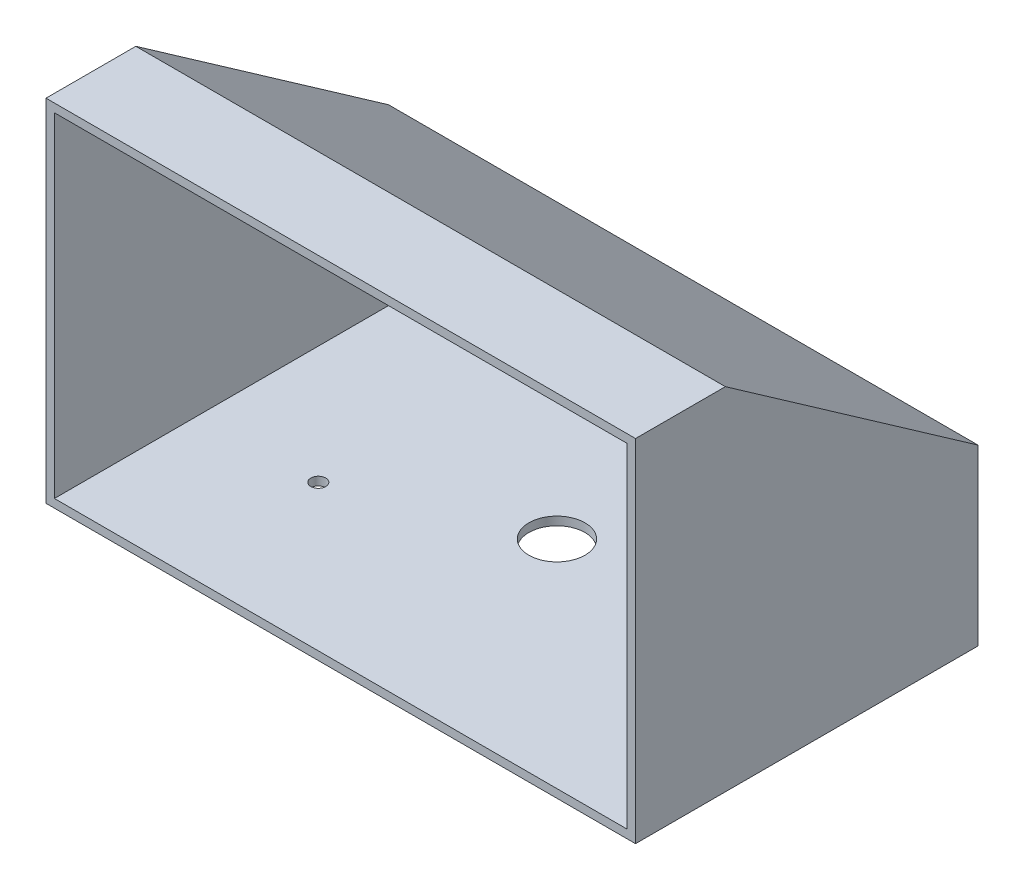
ISO-10303-21;
HEADER;
FILE_DESCRIPTION(('STEP AP214'),'2;1');
FILE_NAME('part.step','',(''),(''),'','','');
FILE_SCHEMA(('AUTOMOTIVE_DESIGN { 1 0 10303 214 1 1 1 1 }'));
ENDSEC;
DATA;
#1=APPLICATION_CONTEXT('core data for automotive mechanical design processes');
#2=APPLICATION_PROTOCOL_DEFINITION('international standard','automotive_design',2000,#1);
#3=PRODUCT_CONTEXT('',#1,'mechanical');
#4=PRODUCT('Part','Part','',(#3));
#5=PRODUCT_RELATED_PRODUCT_CATEGORY('part','',(#4));
#6=PRODUCT_DEFINITION_FORMATION('','',#4);
#7=PRODUCT_DEFINITION_CONTEXT('part definition',#1,'design');
#8=PRODUCT_DEFINITION('design','',#6,#7);
#9=PRODUCT_DEFINITION_SHAPE('','',#8);
#10=(LENGTH_UNIT() NAMED_UNIT(*) SI_UNIT(.MILLI.,.METRE.));
#11=(NAMED_UNIT(*) PLANE_ANGLE_UNIT() SI_UNIT($,.RADIAN.));
#12=(NAMED_UNIT(*) SI_UNIT($,.STERADIAN.) SOLID_ANGLE_UNIT());
#13=UNCERTAINTY_MEASURE_WITH_UNIT(LENGTH_MEASURE(1.E-05),#10,'distance_accuracy_value','');
#14=(GEOMETRIC_REPRESENTATION_CONTEXT(3) GLOBAL_UNCERTAINTY_ASSIGNED_CONTEXT((#13)) GLOBAL_UNIT_ASSIGNED_CONTEXT((#10,
#11,#12)) REPRESENTATION_CONTEXT('',''));
#15=CARTESIAN_POINT('',(0.,0.,0.));
#16=DIRECTION('',(0.,0.,1.));
#17=DIRECTION('',(1.,0.,0.));
#18=AXIS2_PLACEMENT_3D('',#15,#16,#17);
#19=CARTESIAN_POINT('',(105.,0.,52.));
#20=DIRECTION('',(0.,0.,-1.));
#21=DIRECTION('',(-1.,0.,0.));
#22=AXIS2_PLACEMENT_3D('',#19,#20,#21);
#23=PLANE('',#22);
#24=DIRECTION('',(0.,-1.,0.));
#25=VECTOR('',#24,1.);
#26=CARTESIAN_POINT('',(-105.,0.,52.));
#27=LINE('',#26,#25);
#28=CARTESIAN_POINT('',(-105.,125.,52.));
#29=VERTEX_POINT('',#28);
#30=CARTESIAN_POINT('',(-105.,0.,52.));
#31=VERTEX_POINT('',#30);
#32=EDGE_CURVE('E133',#29,#31,#27,.T.);
#33=ORIENTED_EDGE('',*,*,#32,.T.);
#34=DIRECTION('',(-1.,0.,0.));
#35=VECTOR('',#34,1.);
#36=CARTESIAN_POINT('',(105.,0.,52.));
#37=LINE('',#36,#35);
#38=CARTESIAN_POINT('',(105.,0.,52.));
#39=VERTEX_POINT('',#38);
#40=EDGE_CURVE('E118',#39,#31,#37,.T.);
#41=ORIENTED_EDGE('',*,*,#40,.F.);
#42=DIRECTION('',(0.,-1.,0.));
#43=VECTOR('',#42,1.);
#44=CARTESIAN_POINT('',(105.,0.,52.));
#45=LINE('',#44,#43);
#46=CARTESIAN_POINT('',(105.,125.,52.));
#47=VERTEX_POINT('',#46);
#48=EDGE_CURVE('E106',#47,#39,#45,.T.);
#49=ORIENTED_EDGE('',*,*,#48,.F.);
#50=DIRECTION('',(-1.,0.,0.));
#51=VECTOR('',#50,1.);
#52=CARTESIAN_POINT('',(105.,125.,52.));
#53=LINE('',#52,#51);
#54=EDGE_CURVE('E115',#47,#29,#53,.T.);
#55=ORIENTED_EDGE('',*,*,#54,.T.);
#56=EDGE_LOOP('',(#33,#41,#49,#55));
#57=FACE_BOUND('',#56,.T.);
#58=DIRECTION('',(0.,-1.,0.));
#59=VECTOR('',#58,1.);
#60=CARTESIAN_POINT('',(-102.,0.,52.));
#61=LINE('',#60,#59);
#62=CARTESIAN_POINT('',(-102.,122.,52.));
#63=VERTEX_POINT('',#62);
#64=CARTESIAN_POINT('',(-102.,3.,52.));
#65=VERTEX_POINT('',#64);
#66=EDGE_CURVE('E154',#63,#65,#61,.T.);
#67=ORIENTED_EDGE('',*,*,#66,.F.);
#68=DIRECTION('',(-1.,0.,0.));
#69=VECTOR('',#68,1.);
#70=CARTESIAN_POINT('',(105.,122.,52.));
#71=LINE('',#70,#69);
#72=CARTESIAN_POINT('',(102.,122.,52.));
#73=VERTEX_POINT('',#72);
#74=EDGE_CURVE('E153',#73,#63,#71,.T.);
#75=ORIENTED_EDGE('',*,*,#74,.F.);
#76=DIRECTION('',(0.,-1.,0.));
#77=VECTOR('',#76,1.);
#78=CARTESIAN_POINT('',(102.,0.,52.));
#79=LINE('',#78,#77);
#80=CARTESIAN_POINT('',(102.,3.,52.));
#81=VERTEX_POINT('',#80);
#82=EDGE_CURVE('E53',#73,#81,#79,.T.);
#83=ORIENTED_EDGE('',*,*,#82,.T.);
#84=DIRECTION('',(-1.,0.,0.));
#85=VECTOR('',#84,1.);
#86=CARTESIAN_POINT('',(105.,3.,52.));
#87=LINE('',#86,#85);
#88=EDGE_CURVE('E147',#81,#65,#87,.T.);
#89=ORIENTED_EDGE('',*,*,#88,.T.);
#90=EDGE_LOOP('',(#67,#75,#83,#89));
#91=FACE_BOUND('',#90,.T.);
#92=ADVANCED_FACE('F39',(#57,#91),#23,.F.);
#93=CARTESIAN_POINT('',(105.,61.9813215611261,-70.));
#94=DIRECTION('',(0.,0.,1.));
#95=DIRECTION('',(1.,0.,0.));
#96=AXIS2_PLACEMENT_3D('',#93,#94,#95);
#97=PLANE('',#96);
#98=DIRECTION('',(0.,1.,0.));
#99=VECTOR('',#98,1.);
#100=CARTESIAN_POINT('',(-105.,61.9813215611261,-70.));
#101=LINE('',#100,#99);
#102=CARTESIAN_POINT('',(-105.,0.,-70.));
#103=VERTEX_POINT('',#102);
#104=CARTESIAN_POINT('',(-105.,61.9813215611261,-70.));
#105=VERTEX_POINT('',#104);
#106=EDGE_CURVE('E127',#103,#105,#101,.T.);
#107=ORIENTED_EDGE('',*,*,#106,.T.);
#108=DIRECTION('',(-1.,0.,0.));
#109=VECTOR('',#108,1.);
#110=CARTESIAN_POINT('',(105.,61.9813215611261,-70.));
#111=LINE('',#110,#109);
#112=CARTESIAN_POINT('',(105.,61.9813215611261,-70.));
#113=VERTEX_POINT('',#112);
#114=EDGE_CURVE('E11',#113,#105,#111,.T.);
#115=ORIENTED_EDGE('',*,*,#114,.F.);
#116=DIRECTION('',(0.,1.,0.));
#117=VECTOR('',#116,1.);
#118=CARTESIAN_POINT('',(105.,61.9813215611261,-70.));
#119=LINE('',#118,#117);
#120=CARTESIAN_POINT('',(105.,0.,-70.));
#121=VERTEX_POINT('',#120);
#122=EDGE_CURVE('E139',#121,#113,#119,.T.);
#123=ORIENTED_EDGE('',*,*,#122,.F.);
#124=DIRECTION('',(-1.,0.,0.));
#125=VECTOR('',#124,1.);
#126=CARTESIAN_POINT('',(105.,0.,-70.));
#127=LINE('',#126,#125);
#128=EDGE_CURVE('E121',#121,#103,#127,.T.);
#129=ORIENTED_EDGE('',*,*,#128,.T.);
#130=EDGE_LOOP('',(#107,#115,#123,#129));
#131=FACE_BOUND('',#130,.T.);
#132=ADVANCED_FACE('F41',(#131),#97,.F.);
#133=CARTESIAN_POINT('',(105.,125.,20.));
#134=DIRECTION('',(0.,-0.819152044288992,0.573576436351046));
#135=DIRECTION('',(0.,-0.573576436351046,-0.819152044288992));
#136=AXIS2_PLACEMENT_3D('',#133,#134,#135);
#137=PLANE('',#136);
#138=DIRECTION('',(0.,0.573576436351046,0.819152044288992));
#139=VECTOR('',#138,1.);
#140=CARTESIAN_POINT('',(-105.,125.,20.));
#141=LINE('',#140,#139);
#142=CARTESIAN_POINT('',(-105.,125.,20.));
#143=VERTEX_POINT('',#142);
#144=EDGE_CURVE('E129',#105,#143,#141,.T.);
#145=ORIENTED_EDGE('',*,*,#144,.T.);
#146=DIRECTION('',(-1.,0.,0.));
#147=VECTOR('',#146,1.);
#148=CARTESIAN_POINT('',(105.,125.,20.));
#149=LINE('',#148,#147);
#150=CARTESIAN_POINT('',(105.,125.,20.));
#151=VERTEX_POINT('',#150);
#152=EDGE_CURVE('E50',#151,#143,#149,.T.);
#153=ORIENTED_EDGE('',*,*,#152,.F.);
#154=DIRECTION('',(0.,0.573576436351046,0.819152044288992));
#155=VECTOR('',#154,1.);
#156=CARTESIAN_POINT('',(105.,125.,20.));
#157=LINE('',#156,#155);
#158=EDGE_CURVE('E92',#113,#151,#157,.T.);
#159=ORIENTED_EDGE('',*,*,#158,.F.);
#160=ORIENTED_EDGE('',*,*,#114,.T.);
#161=EDGE_LOOP('',(#145,#153,#159,#160));
#162=FACE_BOUND('',#161,.T.);
#163=ADVANCED_FACE('F275',(#162),#137,.F.);
#164=CARTESIAN_POINT('',(105.,125.,52.));
#165=DIRECTION('',(0.,-1.,0.));
#166=DIRECTION('',(0.,0.,-1.));
#167=AXIS2_PLACEMENT_3D('',#164,#165,#166);
#168=PLANE('',#167);
#169=DIRECTION('',(0.,0.,1.));
#170=VECTOR('',#169,1.);
#171=CARTESIAN_POINT('',(-105.,125.,52.));
#172=LINE('',#171,#170);
#173=EDGE_CURVE('E113',#143,#29,#172,.T.);
#174=ORIENTED_EDGE('',*,*,#173,.T.);
#175=ORIENTED_EDGE('',*,*,#54,.F.);
#176=DIRECTION('',(0.,0.,1.));
#177=VECTOR('',#176,1.);
#178=CARTESIAN_POINT('',(105.,125.,52.));
#179=LINE('',#178,#177);
#180=EDGE_CURVE('E105',#151,#47,#179,.T.);
#181=ORIENTED_EDGE('',*,*,#180,.F.);
#182=ORIENTED_EDGE('',*,*,#152,.T.);
#183=EDGE_LOOP('',(#174,#175,#181,#182));
#184=FACE_BOUND('',#183,.T.);
#185=ADVANCED_FACE('F114',(#184),#168,.F.);
#186=CARTESIAN_POINT('',(105.,0.,-70.));
#187=DIRECTION('',(0.,1.,0.));
#188=DIRECTION('',(0.,0.,1.));
#189=AXIS2_PLACEMENT_3D('',#186,#187,#188);
#190=PLANE('',#189);
#191=CARTESIAN_POINT('',(60.,0.,0.));
#192=DIRECTION('',(0.,1.,0.));
#193=DIRECTION('',(0.,0.,1.));
#194=AXIS2_PLACEMENT_3D('',#191,#192,#193);
#195=CIRCLE('',#194,2.65);
#196=CARTESIAN_POINT('',(60.,0.,2.65));
#197=VERTEX_POINT('',#196);
#198=EDGE_CURVE('E203',#197,#197,#195,.T.);
#199=ORIENTED_EDGE('',*,*,#198,.T.);
#200=EDGE_LOOP('',(#199));
#201=FACE_BOUND('',#200,.T.);
#202=CARTESIAN_POINT('',(-60.,0.,0.));
#203=DIRECTION('',(0.,1.,0.));
#204=DIRECTION('',(0.,0.,1.));
#205=AXIS2_PLACEMENT_3D('',#202,#203,#204);
#206=CIRCLE('',#205,2.65);
#207=CARTESIAN_POINT('',(-60.,0.,2.65));
#208=VERTEX_POINT('',#207);
#209=EDGE_CURVE('E196',#208,#208,#206,.T.);
#210=ORIENTED_EDGE('',*,*,#209,.T.);
#211=EDGE_LOOP('',(#210));
#212=FACE_BOUND('',#211,.T.);
#213=CARTESIAN_POINT('',(0.,0.,-25.));
#214=DIRECTION('',(0.,1.,0.));
#215=DIRECTION('',(0.,0.,1.));
#216=AXIS2_PLACEMENT_3D('',#213,#214,#215);
#217=CIRCLE('',#216,10.);
#218=CARTESIAN_POINT('',(0.,0.,-15.));
#219=VERTEX_POINT('',#218);
#220=EDGE_CURVE('E191',#219,#219,#217,.T.);
#221=ORIENTED_EDGE('',*,*,#220,.T.);
#222=EDGE_LOOP('',(#221));
#223=FACE_BOUND('',#222,.T.);
#224=DIRECTION('',(0.,0.,-1.));
#225=VECTOR('',#224,1.);
#226=CARTESIAN_POINT('',(-105.,0.,-70.));
#227=LINE('',#226,#225);
#228=EDGE_CURVE('E87',#31,#103,#227,.T.);
#229=ORIENTED_EDGE('',*,*,#228,.T.);
#230=ORIENTED_EDGE('',*,*,#128,.F.);
#231=DIRECTION('',(0.,0.,-1.));
#232=VECTOR('',#231,1.);
#233=CARTESIAN_POINT('',(105.,0.,-70.));
#234=LINE('',#233,#232);
#235=EDGE_CURVE('E63',#39,#121,#234,.T.);
#236=ORIENTED_EDGE('',*,*,#235,.F.);
#237=ORIENTED_EDGE('',*,*,#40,.T.);
#238=EDGE_LOOP('',(#229,#230,#236,#237));
#239=FACE_BOUND('',#238,.T.);
#240=ADVANCED_FACE('F143',(#201,#212,#223,#239),#190,.F.);
#241=CARTESIAN_POINT('',(105.,0.,0.));
#242=DIRECTION('',(-1.,0.,0.));
#243=DIRECTION('',(0.,0.,1.));
#244=AXIS2_PLACEMENT_3D('',#241,#242,#243);
#245=PLANE('',#244);
#246=ORIENTED_EDGE('',*,*,#122,.T.);
#247=ORIENTED_EDGE('',*,*,#158,.T.);
#248=ORIENTED_EDGE('',*,*,#180,.T.);
#249=ORIENTED_EDGE('',*,*,#48,.T.);
#250=ORIENTED_EDGE('',*,*,#235,.T.);
#251=EDGE_LOOP('',(#246,#247,#248,#249,#250));
#252=FACE_BOUND('',#251,.T.);
#253=ADVANCED_FACE('F102',(#252),#245,.F.);
#254=CARTESIAN_POINT('',(-105.,0.,0.));
#255=DIRECTION('',(-1.,0.,0.));
#256=DIRECTION('',(0.,0.,1.));
#257=AXIS2_PLACEMENT_3D('',#254,#255,#256);
#258=PLANE('',#257);
#259=ORIENTED_EDGE('',*,*,#106,.F.);
#260=ORIENTED_EDGE('',*,*,#228,.F.);
#261=ORIENTED_EDGE('',*,*,#32,.F.);
#262=ORIENTED_EDGE('',*,*,#173,.F.);
#263=ORIENTED_EDGE('',*,*,#144,.F.);
#264=EDGE_LOOP('',(#259,#260,#261,#262,#263));
#265=FACE_BOUND('',#264,.T.);
#266=ADVANCED_FACE('F137',(#265),#258,.T.);
#267=CARTESIAN_POINT('',(105.,61.9813215611261,-67.));
#268=DIRECTION('',(0.,0.,1.));
#269=DIRECTION('',(1.,0.,0.));
#270=AXIS2_PLACEMENT_3D('',#267,#268,#269);
#271=PLANE('',#270);
#272=DIRECTION('',(0.,1.,0.));
#273=VECTOR('',#272,1.);
#274=CARTESIAN_POINT('',(-102.,0.,-67.));
#275=LINE('',#274,#273);
#276=CARTESIAN_POINT('',(-102.,3.,-67.));
#277=VERTEX_POINT('',#276);
#278=CARTESIAN_POINT('',(-102.,60.4196204094709,-67.));
#279=VERTEX_POINT('',#278);
#280=EDGE_CURVE('E178',#277,#279,#275,.T.);
#281=ORIENTED_EDGE('',*,*,#280,.F.);
#282=DIRECTION('',(-1.,0.,0.));
#283=VECTOR('',#282,1.);
#284=CARTESIAN_POINT('',(105.,3.,-67.));
#285=LINE('',#284,#283);
#286=CARTESIAN_POINT('',(102.,3.,-67.));
#287=VERTEX_POINT('',#286);
#288=EDGE_CURVE('E152',#287,#277,#285,.T.);
#289=ORIENTED_EDGE('',*,*,#288,.F.);
#290=DIRECTION('',(0.,1.,0.));
#291=VECTOR('',#290,1.);
#292=CARTESIAN_POINT('',(102.,0.,-67.));
#293=LINE('',#292,#291);
#294=CARTESIAN_POINT('',(102.,60.4196204094709,-67.));
#295=VERTEX_POINT('',#294);
#296=EDGE_CURVE('E164',#287,#295,#293,.T.);
#297=ORIENTED_EDGE('',*,*,#296,.T.);
#298=DIRECTION('',(-1.,0.,0.));
#299=VECTOR('',#298,1.);
#300=CARTESIAN_POINT('',(105.,60.4196204094709,-67.));
#301=LINE('',#300,#299);
#302=EDGE_CURVE('E128',#295,#279,#301,.T.);
#303=ORIENTED_EDGE('',*,*,#302,.T.);
#304=EDGE_LOOP('',(#281,#289,#297,#303));
#305=FACE_BOUND('',#304,.T.);
#306=ADVANCED_FACE('F248',(#305),#271,.T.);
#307=CARTESIAN_POINT('',(105.,122.542543867133,21.7207293090531));
#308=DIRECTION('',(0.,-0.819152044288992,0.573576436351046));
#309=DIRECTION('',(0.,-0.573576436351046,-0.819152044288992));
#310=AXIS2_PLACEMENT_3D('',#307,#308,#309);
#311=PLANE('',#310);
#312=DIRECTION('',(0.,0.573576436351046,0.819152044288992));
#313=VECTOR('',#312,1.);
#314=CARTESIAN_POINT('',(-102.,72.0218766171283,-50.4302609233228));
#315=LINE('',#314,#313);
#316=CARTESIAN_POINT('',(-102.,122.,20.945896366637));
#317=VERTEX_POINT('',#316);
#318=EDGE_CURVE('E175',#279,#317,#315,.T.);
#319=ORIENTED_EDGE('',*,*,#318,.F.);
#320=ORIENTED_EDGE('',*,*,#302,.F.);
#321=DIRECTION('',(0.,0.573576436351046,0.819152044288992));
#322=VECTOR('',#321,1.);
#323=CARTESIAN_POINT('',(102.,72.0218766171283,-50.4302609233228));
#324=LINE('',#323,#322);
#325=CARTESIAN_POINT('',(102.,122.,20.945896366637));
#326=VERTEX_POINT('',#325);
#327=EDGE_CURVE('E166',#295,#326,#324,.T.);
#328=ORIENTED_EDGE('',*,*,#327,.T.);
#329=DIRECTION('',(-1.,0.,0.));
#330=VECTOR('',#329,1.);
#331=CARTESIAN_POINT('',(105.,122.,20.945896366637));
#332=LINE('',#331,#330);
#333=EDGE_CURVE('E165',#326,#317,#332,.T.);
#334=ORIENTED_EDGE('',*,*,#333,.T.);
#335=EDGE_LOOP('',(#319,#320,#328,#334));
#336=FACE_BOUND('',#335,.T.);
#337=ADVANCED_FACE('F246',(#336),#311,.T.);
#338=CARTESIAN_POINT('',(105.,122.,52.));
#339=DIRECTION('',(0.,-1.,0.));
#340=DIRECTION('',(0.,0.,-1.));
#341=AXIS2_PLACEMENT_3D('',#338,#339,#340);
#342=PLANE('',#341);
#343=DIRECTION('',(0.,0.,1.));
#344=VECTOR('',#343,1.);
#345=CARTESIAN_POINT('',(-102.,122.,0.));
#346=LINE('',#345,#344);
#347=EDGE_CURVE('E157',#317,#63,#346,.T.);
#348=ORIENTED_EDGE('',*,*,#347,.F.);
#349=ORIENTED_EDGE('',*,*,#333,.F.);
#350=DIRECTION('',(0.,0.,1.));
#351=VECTOR('',#350,1.);
#352=CARTESIAN_POINT('',(102.,122.,0.));
#353=LINE('',#352,#351);
#354=EDGE_CURVE('E149',#326,#73,#353,.T.);
#355=ORIENTED_EDGE('',*,*,#354,.T.);
#356=ORIENTED_EDGE('',*,*,#74,.T.);
#357=EDGE_LOOP('',(#348,#349,#355,#356));
#358=FACE_BOUND('',#357,.T.);
#359=ADVANCED_FACE('F212',(#358),#342,.T.);
#360=CARTESIAN_POINT('',(105.,3.,-70.));
#361=DIRECTION('',(0.,1.,0.));
#362=DIRECTION('',(0.,0.,1.));
#363=AXIS2_PLACEMENT_3D('',#360,#361,#362);
#364=PLANE('',#363);
#365=CARTESIAN_POINT('',(60.,3.,0.));
#366=DIRECTION('',(0.,1.,0.));
#367=DIRECTION('',(0.,0.,1.));
#368=AXIS2_PLACEMENT_3D('',#365,#366,#367);
#369=CIRCLE('',#368,2.65);
#370=CARTESIAN_POINT('',(60.,3.,2.65));
#371=VERTEX_POINT('',#370);
#372=EDGE_CURVE('E188',#371,#371,#369,.T.);
#373=ORIENTED_EDGE('',*,*,#372,.F.);
#374=EDGE_LOOP('',(#373));
#375=FACE_BOUND('',#374,.T.);
#376=CARTESIAN_POINT('',(-60.,3.,0.));
#377=DIRECTION('',(0.,1.,0.));
#378=DIRECTION('',(0.,0.,1.));
#379=AXIS2_PLACEMENT_3D('',#376,#377,#378);
#380=CIRCLE('',#379,2.65);
#381=CARTESIAN_POINT('',(-60.,3.,2.65));
#382=VERTEX_POINT('',#381);
#383=EDGE_CURVE('E192',#382,#382,#380,.T.);
#384=ORIENTED_EDGE('',*,*,#383,.F.);
#385=EDGE_LOOP('',(#384));
#386=FACE_BOUND('',#385,.T.);
#387=CARTESIAN_POINT('',(0.,3.,-25.));
#388=DIRECTION('',(0.,1.,0.));
#389=DIRECTION('',(0.,0.,1.));
#390=AXIS2_PLACEMENT_3D('',#387,#388,#389);
#391=CIRCLE('',#390,10.);
#392=CARTESIAN_POINT('',(0.,3.,-15.));
#393=VERTEX_POINT('',#392);
#394=EDGE_CURVE('E189',#393,#393,#391,.T.);
#395=ORIENTED_EDGE('',*,*,#394,.F.);
#396=EDGE_LOOP('',(#395));
#397=FACE_BOUND('',#396,.T.);
#398=DIRECTION('',(0.,0.,-1.));
#399=VECTOR('',#398,1.);
#400=CARTESIAN_POINT('',(-102.,3.,0.));
#401=LINE('',#400,#399);
#402=EDGE_CURVE('E158',#65,#277,#401,.T.);
#403=ORIENTED_EDGE('',*,*,#402,.F.);
#404=ORIENTED_EDGE('',*,*,#88,.F.);
#405=DIRECTION('',(0.,0.,-1.));
#406=VECTOR('',#405,1.);
#407=CARTESIAN_POINT('',(102.,3.,0.));
#408=LINE('',#407,#406);
#409=EDGE_CURVE('E146',#81,#287,#408,.T.);
#410=ORIENTED_EDGE('',*,*,#409,.T.);
#411=ORIENTED_EDGE('',*,*,#288,.T.);
#412=EDGE_LOOP('',(#403,#404,#410,#411));
#413=FACE_BOUND('',#412,.T.);
#414=ADVANCED_FACE('F209',(#375,#386,#397,#413),#364,.T.);
#415=CARTESIAN_POINT('',(102.,0.,0.));
#416=DIRECTION('',(-1.,0.,0.));
#417=DIRECTION('',(0.,0.,1.));
#418=AXIS2_PLACEMENT_3D('',#415,#416,#417);
#419=PLANE('',#418);
#420=ORIENTED_EDGE('',*,*,#296,.F.);
#421=ORIENTED_EDGE('',*,*,#409,.F.);
#422=ORIENTED_EDGE('',*,*,#82,.F.);
#423=ORIENTED_EDGE('',*,*,#354,.F.);
#424=ORIENTED_EDGE('',*,*,#327,.F.);
#425=EDGE_LOOP('',(#420,#421,#422,#423,#424));
#426=FACE_BOUND('',#425,.T.);
#427=ADVANCED_FACE('F213',(#426),#419,.T.);
#428=CARTESIAN_POINT('',(-102.,0.,0.));
#429=DIRECTION('',(-1.,0.,0.));
#430=DIRECTION('',(0.,0.,1.));
#431=AXIS2_PLACEMENT_3D('',#428,#429,#430);
#432=PLANE('',#431);
#433=ORIENTED_EDGE('',*,*,#280,.T.);
#434=ORIENTED_EDGE('',*,*,#318,.T.);
#435=ORIENTED_EDGE('',*,*,#347,.T.);
#436=ORIENTED_EDGE('',*,*,#66,.T.);
#437=ORIENTED_EDGE('',*,*,#402,.T.);
#438=EDGE_LOOP('',(#433,#434,#435,#436,#437));
#439=FACE_BOUND('',#438,.T.);
#440=ADVANCED_FACE('F253',(#439),#432,.F.);
#441=CARTESIAN_POINT('',(0.,3.,-25.));
#442=DIRECTION('',(0.,-1.,0.));
#443=DIRECTION('',(0.,0.,-1.));
#444=AXIS2_PLACEMENT_3D('',#441,#442,#443);
#445=CYLINDRICAL_SURFACE('',#444,10.);
#446=ORIENTED_EDGE('',*,*,#394,.T.);
#447=EDGE_LOOP('',(#446));
#448=FACE_BOUND('',#447,.T.);
#449=ORIENTED_EDGE('',*,*,#220,.F.);
#450=EDGE_LOOP('',(#449));
#451=FACE_BOUND('',#450,.T.);
#452=ADVANCED_FACE('F251',(#448,#451),#445,.F.);
#453=CARTESIAN_POINT('',(-60.,3.,0.));
#454=DIRECTION('',(0.,-1.,0.));
#455=DIRECTION('',(0.,0.,-1.));
#456=AXIS2_PLACEMENT_3D('',#453,#454,#455);
#457=CYLINDRICAL_SURFACE('',#456,2.65);
#458=ORIENTED_EDGE('',*,*,#383,.T.);
#459=EDGE_LOOP('',(#458));
#460=FACE_BOUND('',#459,.T.);
#461=ORIENTED_EDGE('',*,*,#209,.F.);
#462=EDGE_LOOP('',(#461));
#463=FACE_BOUND('',#462,.T.);
#464=ADVANCED_FACE('F257',(#460,#463),#457,.F.);
#465=CARTESIAN_POINT('',(60.,3.,0.));
#466=DIRECTION('',(0.,-1.,0.));
#467=DIRECTION('',(0.,0.,-1.));
#468=AXIS2_PLACEMENT_3D('',#465,#466,#467);
#469=CYLINDRICAL_SURFACE('',#468,2.65);
#470=ORIENTED_EDGE('',*,*,#372,.T.);
#471=EDGE_LOOP('',(#470));
#472=FACE_BOUND('',#471,.T.);
#473=ORIENTED_EDGE('',*,*,#198,.F.);
#474=EDGE_LOOP('',(#473));
#475=FACE_BOUND('',#474,.T.);
#476=ADVANCED_FACE('F210',(#472,#475),#469,.F.);
#477=CLOSED_SHELL('',(#92,#132,#163,#185,#240,#253,#266,#306,#337,#359,#414,#427,#440,#452,#464,#476));
#478=MANIFOLD_SOLID_BREP('B2',#477);
#479=ADVANCED_BREP_SHAPE_REPRESENTATION('',(#18,#478),#14);
#480=SHAPE_DEFINITION_REPRESENTATION(#9,#479);
ENDSEC;
END-ISO-10303-21;
